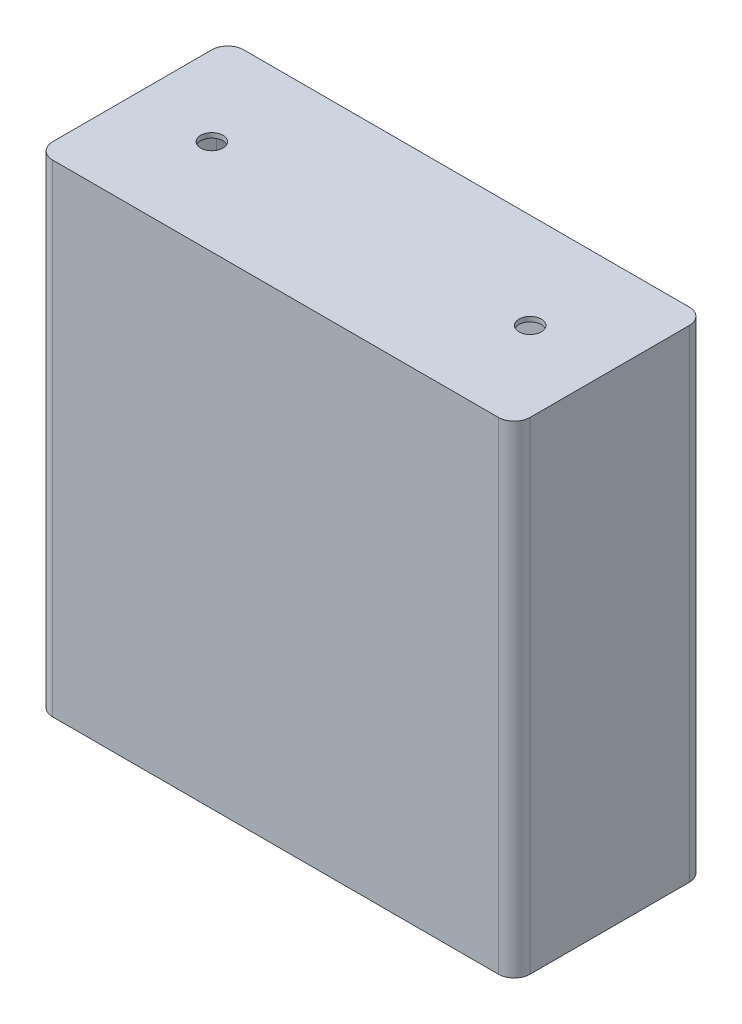
ISO-10303-21;
HEADER;
FILE_DESCRIPTION(('STEP AP214'),'2;1');
FILE_NAME('part.step','',(''),(''),'','','');
FILE_SCHEMA(('AUTOMOTIVE_DESIGN { 1 0 10303 214 1 1 1 1 }'));
ENDSEC;
DATA;
#1=APPLICATION_CONTEXT('core data for automotive mechanical design processes');
#2=APPLICATION_PROTOCOL_DEFINITION('international standard','automotive_design',2000,#1);
#3=PRODUCT_CONTEXT('',#1,'mechanical');
#4=PRODUCT('Part','Part','',(#3));
#5=PRODUCT_RELATED_PRODUCT_CATEGORY('part','',(#4));
#6=PRODUCT_DEFINITION_FORMATION('','',#4);
#7=PRODUCT_DEFINITION_CONTEXT('part definition',#1,'design');
#8=PRODUCT_DEFINITION('design','',#6,#7);
#9=PRODUCT_DEFINITION_SHAPE('','',#8);
#10=(LENGTH_UNIT() NAMED_UNIT(*) SI_UNIT(.MILLI.,.METRE.));
#11=(NAMED_UNIT(*) PLANE_ANGLE_UNIT() SI_UNIT($,.RADIAN.));
#12=(NAMED_UNIT(*) SI_UNIT($,.STERADIAN.) SOLID_ANGLE_UNIT());
#13=UNCERTAINTY_MEASURE_WITH_UNIT(LENGTH_MEASURE(1.E-05),#10,'distance_accuracy_value','');
#14=(GEOMETRIC_REPRESENTATION_CONTEXT(3) GLOBAL_UNCERTAINTY_ASSIGNED_CONTEXT((#13)) GLOBAL_UNIT_ASSIGNED_CONTEXT((#10,
#11,#12)) REPRESENTATION_CONTEXT('',''));
#15=CARTESIAN_POINT('',(0.,0.,0.));
#16=DIRECTION('',(0.,0.,1.));
#17=DIRECTION('',(1.,0.,0.));
#18=AXIS2_PLACEMENT_3D('',#15,#16,#17);
#19=CARTESIAN_POINT('',(290.,3.,-110.));
#20=DIRECTION('',(0.,-1.,0.));
#21=DIRECTION('',(0.,0.,-1.));
#22=AXIS2_PLACEMENT_3D('',#19,#20,#21);
#23=PLANE('',#22);
#24=CARTESIAN_POINT('',(50.,3.,-60.));
#25=DIRECTION('',(0.,-1.,0.));
#26=DIRECTION('',(0.,0.,-1.));
#27=AXIS2_PLACEMENT_3D('',#24,#25,#26);
#28=CIRCLE('',#27,7.);
#29=CARTESIAN_POINT('',(50.,3.,-67.));
#30=VERTEX_POINT('',#29);
#31=EDGE_CURVE('E194',#30,#30,#28,.T.);
#32=ORIENTED_EDGE('',*,*,#31,.T.);
#33=EDGE_LOOP('',(#32));
#34=FACE_BOUND('',#33,.T.);
#35=CARTESIAN_POINT('',(250.,3.,-60.));
#36=DIRECTION('',(0.,-1.,0.));
#37=DIRECTION('',(0.,0.,-1.));
#38=AXIS2_PLACEMENT_3D('',#35,#36,#37);
#39=CIRCLE('',#38,6.99999999999999);
#40=CARTESIAN_POINT('',(250.,3.,-67.));
#41=VERTEX_POINT('',#40);
#42=EDGE_CURVE('E350',#41,#41,#39,.T.);
#43=ORIENTED_EDGE('',*,*,#42,.T.);
#44=EDGE_LOOP('',(#43));
#45=FACE_BOUND('',#44,.T.);
#46=CARTESIAN_POINT('',(290.,3.,-110.));
#47=DIRECTION('',(0.,-1.,0.));
#48=DIRECTION('',(0.,0.,-1.));
#49=AXIS2_PLACEMENT_3D('',#46,#47,#48);
#50=CIRCLE('',#49,6.99999999999999);
#51=CARTESIAN_POINT('',(297.,3.,-110.));
#52=VERTEX_POINT('',#51);
#53=CARTESIAN_POINT('',(290.,3.,-117.));
#54=VERTEX_POINT('',#53);
#55=EDGE_CURVE('E216',#52,#54,#50,.F.);
#56=ORIENTED_EDGE('',*,*,#55,.T.);
#57=DIRECTION('',(-1.,0.,0.));
#58=VECTOR('',#57,1.);
#59=CARTESIAN_POINT('',(290.,3.,-117.));
#60=LINE('',#59,#58);
#61=CARTESIAN_POINT('',(10.,3.,-117.));
#62=VERTEX_POINT('',#61);
#63=EDGE_CURVE('E220',#54,#62,#60,.T.);
#64=ORIENTED_EDGE('',*,*,#63,.T.);
#65=CARTESIAN_POINT('',(10.,3.,-110.));
#66=DIRECTION('',(0.,-1.,0.));
#67=DIRECTION('',(0.,0.,-1.));
#68=AXIS2_PLACEMENT_3D('',#65,#66,#67);
#69=CIRCLE('',#68,6.99999999999999);
#70=CARTESIAN_POINT('',(3.00000000000006,3.,-110.));
#71=VERTEX_POINT('',#70);
#72=EDGE_CURVE('E234',#62,#71,#69,.F.);
#73=ORIENTED_EDGE('',*,*,#72,.T.);
#74=DIRECTION('',(0.,0.,1.));
#75=VECTOR('',#74,1.);
#76=CARTESIAN_POINT('',(3.00000000000006,3.,-110.));
#77=LINE('',#76,#75);
#78=CARTESIAN_POINT('',(3.,3.,-10.));
#79=VERTEX_POINT('',#78);
#80=EDGE_CURVE('E241',#71,#79,#77,.T.);
#81=ORIENTED_EDGE('',*,*,#80,.T.);
#82=CARTESIAN_POINT('',(10.,3.,-10.));
#83=DIRECTION('',(0.,-1.,0.));
#84=DIRECTION('',(0.,0.,-1.));
#85=AXIS2_PLACEMENT_3D('',#82,#83,#84);
#86=CIRCLE('',#85,7.);
#87=CARTESIAN_POINT('',(10.,3.,-3.));
#88=VERTEX_POINT('',#87);
#89=EDGE_CURVE('E248',#79,#88,#86,.F.);
#90=ORIENTED_EDGE('',*,*,#89,.T.);
#91=DIRECTION('',(1.,0.,0.));
#92=VECTOR('',#91,1.);
#93=CARTESIAN_POINT('',(290.,3.,-3.));
#94=LINE('',#93,#92);
#95=CARTESIAN_POINT('',(290.,3.,-3.00000000000003));
#96=VERTEX_POINT('',#95);
#97=EDGE_CURVE('E255',#88,#96,#94,.T.);
#98=ORIENTED_EDGE('',*,*,#97,.T.);
#99=CARTESIAN_POINT('',(290.,3.,-10.));
#100=DIRECTION('',(0.,-1.,0.));
#101=DIRECTION('',(0.,0.,-1.));
#102=AXIS2_PLACEMENT_3D('',#99,#100,#101);
#103=CIRCLE('',#102,6.99999999999998);
#104=CARTESIAN_POINT('',(297.,3.,-10.));
#105=VERTEX_POINT('',#104);
#106=EDGE_CURVE('E262',#96,#105,#103,.F.);
#107=ORIENTED_EDGE('',*,*,#106,.T.);
#108=DIRECTION('',(0.,0.,-1.));
#109=VECTOR('',#108,1.);
#110=CARTESIAN_POINT('',(297.,3.,-110.));
#111=LINE('',#110,#109);
#112=EDGE_CURVE('E268',#105,#52,#111,.T.);
#113=ORIENTED_EDGE('',*,*,#112,.T.);
#114=EDGE_LOOP('',(#56,#64,#73,#81,#90,#98,#107,#113));
#115=FACE_BOUND('',#114,.T.);
#116=ADVANCED_FACE('F48',(#34,#45,#115),#23,.F.);
#117=CARTESIAN_POINT('',(10.,300.,-117.));
#118=DIRECTION('',(0.,0.,1.));
#119=DIRECTION('',(1.,0.,0.));
#120=AXIS2_PLACEMENT_3D('',#117,#118,#119);
#121=PLANE('',#120);
#122=ORIENTED_EDGE('',*,*,#63,.F.);
#123=DIRECTION('',(0.,1.,0.));
#124=VECTOR('',#123,1.);
#125=CARTESIAN_POINT('',(290.,300.,-117.));
#126=LINE('',#125,#124);
#127=CARTESIAN_POINT('',(290.,300.,-117.));
#128=VERTEX_POINT('',#127);
#129=EDGE_CURVE('E221',#128,#54,#126,.F.);
#130=ORIENTED_EDGE('',*,*,#129,.F.);
#131=DIRECTION('',(-1.,0.,0.));
#132=VECTOR('',#131,1.);
#133=CARTESIAN_POINT('',(290.,300.,-117.));
#134=LINE('',#133,#132);
#135=CARTESIAN_POINT('',(10.,300.,-117.));
#136=VERTEX_POINT('',#135);
#137=EDGE_CURVE('E278',#128,#136,#134,.T.);
#138=ORIENTED_EDGE('',*,*,#137,.T.);
#139=DIRECTION('',(0.,-1.,0.));
#140=VECTOR('',#139,1.);
#141=CARTESIAN_POINT('',(10.,300.,-117.));
#142=LINE('',#141,#140);
#143=EDGE_CURVE('E225',#136,#62,#142,.T.);
#144=ORIENTED_EDGE('',*,*,#143,.T.);
#145=EDGE_LOOP('',(#122,#130,#138,#144));
#146=FACE_BOUND('',#145,.T.);
#147=ADVANCED_FACE('F401',(#146),#121,.T.);
#148=CARTESIAN_POINT('',(10.,300.,-110.));
#149=DIRECTION('',(0.,-1.,0.));
#150=DIRECTION('',(0.,0.,-1.));
#151=AXIS2_PLACEMENT_3D('',#148,#149,#150);
#152=CYLINDRICAL_SURFACE('',#151,6.99999999999999);
#153=ORIENTED_EDGE('',*,*,#72,.F.);
#154=ORIENTED_EDGE('',*,*,#143,.F.);
#155=CARTESIAN_POINT('',(10.,300.,-110.));
#156=DIRECTION('',(0.,-1.,0.));
#157=DIRECTION('',(0.,0.,-1.));
#158=AXIS2_PLACEMENT_3D('',#155,#156,#157);
#159=CIRCLE('',#158,6.99999999999999);
#160=CARTESIAN_POINT('',(3.00000000000002,300.,-110.));
#161=VERTEX_POINT('',#160);
#162=EDGE_CURVE('E282',#136,#161,#159,.F.);
#163=ORIENTED_EDGE('',*,*,#162,.T.);
#164=DIRECTION('',(0.,1.,0.));
#165=VECTOR('',#164,1.);
#166=CARTESIAN_POINT('',(3.00000000000006,300.,-110.));
#167=LINE('',#166,#165);
#168=EDGE_CURVE('E238',#161,#71,#167,.F.);
#169=ORIENTED_EDGE('',*,*,#168,.T.);
#170=EDGE_LOOP('',(#153,#154,#163,#169));
#171=FACE_BOUND('',#170,.T.);
#172=ADVANCED_FACE('F406',(#171),#152,.F.);
#173=CARTESIAN_POINT('',(3.,300.,-10.0000000000001));
#174=DIRECTION('',(1.,0.,0.));
#175=DIRECTION('',(0.,0.,-1.));
#176=AXIS2_PLACEMENT_3D('',#173,#174,#175);
#177=PLANE('',#176);
#178=ORIENTED_EDGE('',*,*,#80,.F.);
#179=ORIENTED_EDGE('',*,*,#168,.F.);
#180=DIRECTION('',(0.,0.,1.));
#181=VECTOR('',#180,1.);
#182=CARTESIAN_POINT('',(3.00000000000006,300.,-110.));
#183=LINE('',#182,#181);
#184=CARTESIAN_POINT('',(3.,300.,-10.0000000000001));
#185=VERTEX_POINT('',#184);
#186=EDGE_CURVE('E286',#161,#185,#183,.T.);
#187=ORIENTED_EDGE('',*,*,#186,.T.);
#188=DIRECTION('',(0.,-1.,0.));
#189=VECTOR('',#188,1.);
#190=CARTESIAN_POINT('',(3.,300.,-10.));
#191=LINE('',#190,#189);
#192=EDGE_CURVE('E245',#185,#79,#191,.T.);
#193=ORIENTED_EDGE('',*,*,#192,.T.);
#194=EDGE_LOOP('',(#178,#179,#187,#193));
#195=FACE_BOUND('',#194,.T.);
#196=ADVANCED_FACE('F507',(#195),#177,.T.);
#197=CARTESIAN_POINT('',(10.,300.,-10.));
#198=DIRECTION('',(0.,-1.,0.));
#199=DIRECTION('',(0.,0.,-1.));
#200=AXIS2_PLACEMENT_3D('',#197,#198,#199);
#201=CYLINDRICAL_SURFACE('',#200,7.);
#202=ORIENTED_EDGE('',*,*,#89,.F.);
#203=ORIENTED_EDGE('',*,*,#192,.F.);
#204=CARTESIAN_POINT('',(10.,300.,-10.));
#205=DIRECTION('',(0.,-1.,0.));
#206=DIRECTION('',(0.,0.,-1.));
#207=AXIS2_PLACEMENT_3D('',#204,#205,#206);
#208=CIRCLE('',#207,7.);
#209=CARTESIAN_POINT('',(10.,300.,-3.));
#210=VERTEX_POINT('',#209);
#211=EDGE_CURVE('E290',#185,#210,#208,.F.);
#212=ORIENTED_EDGE('',*,*,#211,.T.);
#213=DIRECTION('',(0.,1.,0.));
#214=VECTOR('',#213,1.);
#215=CARTESIAN_POINT('',(10.,300.,-3.));
#216=LINE('',#215,#214);
#217=EDGE_CURVE('E252',#210,#88,#216,.F.);
#218=ORIENTED_EDGE('',*,*,#217,.T.);
#219=EDGE_LOOP('',(#202,#203,#212,#218));
#220=FACE_BOUND('',#219,.T.);
#221=ADVANCED_FACE('F498',(#220),#201,.F.);
#222=CARTESIAN_POINT('',(10.0000000000001,300.,-3.));
#223=DIRECTION('',(0.,0.,-1.));
#224=DIRECTION('',(-1.,0.,0.));
#225=AXIS2_PLACEMENT_3D('',#222,#223,#224);
#226=PLANE('',#225);
#227=ORIENTED_EDGE('',*,*,#97,.F.);
#228=ORIENTED_EDGE('',*,*,#217,.F.);
#229=DIRECTION('',(1.,0.,0.));
#230=VECTOR('',#229,1.);
#231=CARTESIAN_POINT('',(290.,300.,-3.));
#232=LINE('',#231,#230);
#233=CARTESIAN_POINT('',(290.,300.,-3.));
#234=VERTEX_POINT('',#233);
#235=EDGE_CURVE('E294',#210,#234,#232,.T.);
#236=ORIENTED_EDGE('',*,*,#235,.T.);
#237=DIRECTION('',(0.,-1.,0.));
#238=VECTOR('',#237,1.);
#239=CARTESIAN_POINT('',(290.,300.,-3.00000000000003));
#240=LINE('',#239,#238);
#241=EDGE_CURVE('E259',#234,#96,#240,.T.);
#242=ORIENTED_EDGE('',*,*,#241,.T.);
#243=EDGE_LOOP('',(#227,#228,#236,#242));
#244=FACE_BOUND('',#243,.T.);
#245=ADVANCED_FACE('F490',(#244),#226,.T.);
#246=CARTESIAN_POINT('',(290.,300.,-10.));
#247=DIRECTION('',(0.,-1.,0.));
#248=DIRECTION('',(0.,0.,-1.));
#249=AXIS2_PLACEMENT_3D('',#246,#247,#248);
#250=CYLINDRICAL_SURFACE('',#249,6.99999999999998);
#251=ORIENTED_EDGE('',*,*,#106,.F.);
#252=ORIENTED_EDGE('',*,*,#241,.F.);
#253=CARTESIAN_POINT('',(290.,300.,-10.));
#254=DIRECTION('',(0.,-1.,0.));
#255=DIRECTION('',(0.,0.,-1.));
#256=AXIS2_PLACEMENT_3D('',#253,#254,#255);
#257=CIRCLE('',#256,6.99999999999998);
#258=CARTESIAN_POINT('',(297.,300.,-10.));
#259=VERTEX_POINT('',#258);
#260=EDGE_CURVE('E297',#234,#259,#257,.F.);
#261=ORIENTED_EDGE('',*,*,#260,.T.);
#262=DIRECTION('',(0.,1.,0.));
#263=VECTOR('',#262,1.);
#264=CARTESIAN_POINT('',(297.,300.,-10.));
#265=LINE('',#264,#263);
#266=EDGE_CURVE('E230',#259,#105,#265,.F.);
#267=ORIENTED_EDGE('',*,*,#266,.T.);
#268=EDGE_LOOP('',(#251,#252,#261,#267));
#269=FACE_BOUND('',#268,.T.);
#270=ADVANCED_FACE('F482',(#269),#250,.F.);
#271=CARTESIAN_POINT('',(297.,300.,-10.));
#272=DIRECTION('',(-1.,0.,0.));
#273=DIRECTION('',(0.,0.,1.));
#274=AXIS2_PLACEMENT_3D('',#271,#272,#273);
#275=PLANE('',#274);
#276=ORIENTED_EDGE('',*,*,#112,.F.);
#277=ORIENTED_EDGE('',*,*,#266,.F.);
#278=DIRECTION('',(0.,0.,-1.));
#279=VECTOR('',#278,1.);
#280=CARTESIAN_POINT('',(297.,300.,-110.));
#281=LINE('',#280,#279);
#282=CARTESIAN_POINT('',(297.,300.,-110.));
#283=VERTEX_POINT('',#282);
#284=EDGE_CURVE('E231',#259,#283,#281,.T.);
#285=ORIENTED_EDGE('',*,*,#284,.T.);
#286=DIRECTION('',(0.,-1.,0.));
#287=VECTOR('',#286,1.);
#288=CARTESIAN_POINT('',(297.,300.,-110.));
#289=LINE('',#288,#287);
#290=EDGE_CURVE('E226',#283,#52,#289,.T.);
#291=ORIENTED_EDGE('',*,*,#290,.T.);
#292=EDGE_LOOP('',(#276,#277,#285,#291));
#293=FACE_BOUND('',#292,.T.);
#294=ADVANCED_FACE('F412',(#293),#275,.T.);
#295=CARTESIAN_POINT('',(290.,300.,-110.));
#296=DIRECTION('',(0.,-1.,0.));
#297=DIRECTION('',(0.,0.,-1.));
#298=AXIS2_PLACEMENT_3D('',#295,#296,#297);
#299=CYLINDRICAL_SURFACE('',#298,6.99999999999999);
#300=ORIENTED_EDGE('',*,*,#55,.F.);
#301=ORIENTED_EDGE('',*,*,#290,.F.);
#302=CARTESIAN_POINT('',(290.,300.,-110.));
#303=DIRECTION('',(0.,-1.,0.));
#304=DIRECTION('',(0.,0.,-1.));
#305=AXIS2_PLACEMENT_3D('',#302,#303,#304);
#306=CIRCLE('',#305,6.99999999999999);
#307=EDGE_CURVE('E274',#283,#128,#306,.F.);
#308=ORIENTED_EDGE('',*,*,#307,.T.);
#309=ORIENTED_EDGE('',*,*,#129,.T.);
#310=EDGE_LOOP('',(#300,#301,#308,#309));
#311=FACE_BOUND('',#310,.T.);
#312=ADVANCED_FACE('F465',(#311),#299,.F.);
#313=CARTESIAN_POINT('',(290.,300.,-110.));
#314=DIRECTION('',(0.,1.,0.));
#315=DIRECTION('',(0.,0.,1.));
#316=AXIS2_PLACEMENT_3D('',#313,#314,#315);
#317=PLANE('',#316);
#318=CARTESIAN_POINT('',(50.,300.,-60.));
#319=DIRECTION('',(0.,1.,0.));
#320=DIRECTION('',(0.,0.,1.));
#321=AXIS2_PLACEMENT_3D('',#318,#319,#320);
#322=CIRCLE('',#321,7.);
#323=CARTESIAN_POINT('',(50.,300.,-53.));
#324=VERTEX_POINT('',#323);
#325=EDGE_CURVE('E52',#324,#324,#322,.T.);
#326=ORIENTED_EDGE('',*,*,#325,.T.);
#327=EDGE_LOOP('',(#326));
#328=FACE_BOUND('',#327,.T.);
#329=CARTESIAN_POINT('',(250.,300.,-60.));
#330=DIRECTION('',(0.,1.,0.));
#331=DIRECTION('',(0.,0.,1.));
#332=AXIS2_PLACEMENT_3D('',#329,#330,#331);
#333=CIRCLE('',#332,6.99999999999999);
#334=CARTESIAN_POINT('',(250.,300.,-53.0000000000001));
#335=VERTEX_POINT('',#334);
#336=EDGE_CURVE('E347',#335,#335,#333,.T.);
#337=ORIENTED_EDGE('',*,*,#336,.T.);
#338=EDGE_LOOP('',(#337));
#339=FACE_BOUND('',#338,.T.);
#340=ORIENTED_EDGE('',*,*,#307,.F.);
#341=ORIENTED_EDGE('',*,*,#284,.F.);
#342=ORIENTED_EDGE('',*,*,#260,.F.);
#343=ORIENTED_EDGE('',*,*,#235,.F.);
#344=ORIENTED_EDGE('',*,*,#211,.F.);
#345=ORIENTED_EDGE('',*,*,#186,.F.);
#346=ORIENTED_EDGE('',*,*,#162,.F.);
#347=ORIENTED_EDGE('',*,*,#137,.F.);
#348=EDGE_LOOP('',(#340,#341,#342,#343,#344,#345,#346,#347));
#349=FACE_BOUND('',#348,.T.);
#350=ADVANCED_FACE('F382',(#328,#339,#349),#317,.F.);
#351=CARTESIAN_POINT('',(250.,0.,-60.));
#352=DIRECTION('',(0.,1.,0.));
#353=DIRECTION('',(0.,0.,1.));
#354=AXIS2_PLACEMENT_3D('',#351,#352,#353);
#355=CYLINDRICAL_SURFACE('',#354,6.99999999999999);
#356=CARTESIAN_POINT('',(250.,303.,-60.));
#357=DIRECTION('',(0.,1.,0.));
#358=DIRECTION('',(0.,0.,1.));
#359=AXIS2_PLACEMENT_3D('',#356,#357,#358);
#360=CIRCLE('',#359,6.99999999999999);
#361=CARTESIAN_POINT('',(250.,303.,-53.0000000000001));
#362=VERTEX_POINT('',#361);
#363=EDGE_CURVE('E357',#362,#362,#360,.T.);
#364=ORIENTED_EDGE('',*,*,#363,.T.);
#365=EDGE_LOOP('',(#364));
#366=FACE_BOUND('',#365,.T.);
#367=ORIENTED_EDGE('',*,*,#336,.F.);
#368=EDGE_LOOP('',(#367));
#369=FACE_BOUND('',#368,.T.);
#370=ADVANCED_FACE('F387',(#366,#369),#355,.F.);
#371=CARTESIAN_POINT('',(50.,0.,-60.));
#372=DIRECTION('',(0.,1.,0.));
#373=DIRECTION('',(0.,0.,1.));
#374=AXIS2_PLACEMENT_3D('',#371,#372,#373);
#375=CYLINDRICAL_SURFACE('',#374,7.);
#376=CARTESIAN_POINT('',(50.,303.,-60.));
#377=DIRECTION('',(0.,1.,0.));
#378=DIRECTION('',(0.,0.,1.));
#379=AXIS2_PLACEMENT_3D('',#376,#377,#378);
#380=CIRCLE('',#379,7.);
#381=CARTESIAN_POINT('',(50.,303.,-53.));
#382=VERTEX_POINT('',#381);
#383=EDGE_CURVE('E187',#382,#382,#380,.T.);
#384=ORIENTED_EDGE('',*,*,#383,.T.);
#385=EDGE_LOOP('',(#384));
#386=FACE_BOUND('',#385,.T.);
#387=ORIENTED_EDGE('',*,*,#325,.F.);
#388=EDGE_LOOP('',(#387));
#389=FACE_BOUND('',#388,.T.);
#390=ADVANCED_FACE('F384',(#386,#389),#375,.F.);
#391=CARTESIAN_POINT('',(250.,0.,-60.));
#392=DIRECTION('',(0.,1.,0.));
#393=DIRECTION('',(0.,0.,-1.));
#394=AXIS2_PLACEMENT_3D('',#391,#392,#393);
#395=CIRCLE('',#394,6.99999999999999);
#396=CARTESIAN_POINT('',(250.,0.,-67.));
#397=VERTEX_POINT('',#396);
#398=EDGE_CURVE('E361',#397,#397,#395,.T.);
#399=ORIENTED_EDGE('',*,*,#398,.F.);
#400=EDGE_LOOP('',(#399));
#401=FACE_BOUND('',#400,.T.);
#402=ORIENTED_EDGE('',*,*,#42,.F.);
#403=EDGE_LOOP('',(#402));
#404=FACE_BOUND('',#403,.T.);
#405=ADVANCED_FACE('F386',(#401,#404),#355,.F.);
#406=CARTESIAN_POINT('',(50.,0.,-60.));
#407=DIRECTION('',(0.,1.,0.));
#408=DIRECTION('',(0.,0.,1.));
#409=AXIS2_PLACEMENT_3D('',#406,#407,#408);
#410=CIRCLE('',#409,7.);
#411=CARTESIAN_POINT('',(50.,0.,-53.));
#412=VERTEX_POINT('',#411);
#413=EDGE_CURVE('E351',#412,#412,#410,.T.);
#414=ORIENTED_EDGE('',*,*,#413,.F.);
#415=EDGE_LOOP('',(#414));
#416=FACE_BOUND('',#415,.T.);
#417=ORIENTED_EDGE('',*,*,#31,.F.);
#418=EDGE_LOOP('',(#417));
#419=FACE_BOUND('',#418,.T.);
#420=ADVANCED_FACE('F390',(#416,#419),#375,.F.);
#421=CARTESIAN_POINT('',(290.,300.,-110.));
#422=DIRECTION('',(0.,-1.,0.));
#423=DIRECTION('',(0.,0.,-1.));
#424=AXIS2_PLACEMENT_3D('',#421,#422,#423);
#425=CYLINDRICAL_SURFACE('',#424,9.99999999999999);
#426=CARTESIAN_POINT('',(290.,0.,-110.));
#427=DIRECTION('',(0.,1.,0.));
#428=DIRECTION('',(0.,0.,-1.));
#429=AXIS2_PLACEMENT_3D('',#426,#427,#428);
#430=CIRCLE('',#429,9.99999999999999);
#431=CARTESIAN_POINT('',(300.,0.,-110.));
#432=VERTEX_POINT('',#431);
#433=CARTESIAN_POINT('',(290.,0.,-120.));
#434=VERTEX_POINT('',#433);
#435=EDGE_CURVE('E169',#432,#434,#430,.T.);
#436=ORIENTED_EDGE('',*,*,#435,.T.);
#437=DIRECTION('',(0.,-1.,0.));
#438=VECTOR('',#437,1.);
#439=CARTESIAN_POINT('',(290.,300.,-120.));
#440=LINE('',#439,#438);
#441=CARTESIAN_POINT('',(290.,303.,-120.));
#442=VERTEX_POINT('',#441);
#443=EDGE_CURVE('E11',#442,#434,#440,.T.);
#444=ORIENTED_EDGE('',*,*,#443,.F.);
#445=CARTESIAN_POINT('',(290.,303.,-110.));
#446=DIRECTION('',(0.,1.,0.));
#447=DIRECTION('',(0.,0.,1.));
#448=AXIS2_PLACEMENT_3D('',#445,#446,#447);
#449=CIRCLE('',#448,10.);
#450=CARTESIAN_POINT('',(300.,303.,-110.));
#451=VERTEX_POINT('',#450);
#452=EDGE_CURVE('E167',#451,#442,#449,.T.);
#453=ORIENTED_EDGE('',*,*,#452,.F.);
#454=DIRECTION('',(0.,-1.,0.));
#455=VECTOR('',#454,1.);
#456=CARTESIAN_POINT('',(300.,300.,-110.));
#457=LINE('',#456,#455);
#458=EDGE_CURVE('E325',#451,#432,#457,.T.);
#459=ORIENTED_EDGE('',*,*,#458,.T.);
#460=EDGE_LOOP('',(#436,#444,#453,#459));
#461=FACE_BOUND('',#460,.T.);
#462=ADVANCED_FACE('F50',(#461),#425,.T.);
#463=CARTESIAN_POINT('',(10.,300.,-120.));
#464=DIRECTION('',(0.,0.,1.));
#465=DIRECTION('',(1.,0.,0.));
#466=AXIS2_PLACEMENT_3D('',#463,#464,#465);
#467=PLANE('',#466);
#468=DIRECTION('',(-1.,0.,0.));
#469=VECTOR('',#468,1.);
#470=CARTESIAN_POINT('',(10.,0.,-120.));
#471=LINE('',#470,#469);
#472=CARTESIAN_POINT('',(10.,0.,-120.));
#473=VERTEX_POINT('',#472);
#474=EDGE_CURVE('E306',#434,#473,#471,.T.);
#475=ORIENTED_EDGE('',*,*,#474,.T.);
#476=DIRECTION('',(0.,-1.,0.));
#477=VECTOR('',#476,1.);
#478=CARTESIAN_POINT('',(10.,300.,-120.));
#479=LINE('',#478,#477);
#480=CARTESIAN_POINT('',(10.,303.,-120.));
#481=VERTEX_POINT('',#480);
#482=EDGE_CURVE('E58',#481,#473,#479,.T.);
#483=ORIENTED_EDGE('',*,*,#482,.F.);
#484=DIRECTION('',(-1.,0.,0.));
#485=VECTOR('',#484,1.);
#486=CARTESIAN_POINT('',(10.,303.,-120.));
#487=LINE('',#486,#485);
#488=EDGE_CURVE('E172',#442,#481,#487,.T.);
#489=ORIENTED_EDGE('',*,*,#488,.F.);
#490=ORIENTED_EDGE('',*,*,#443,.T.);
#491=EDGE_LOOP('',(#475,#483,#489,#490));
#492=FACE_BOUND('',#491,.T.);
#493=ADVANCED_FACE('F173',(#492),#467,.F.);
#494=CARTESIAN_POINT('',(10.,300.,-110.));
#495=DIRECTION('',(0.,-1.,0.));
#496=DIRECTION('',(0.,0.,-1.));
#497=AXIS2_PLACEMENT_3D('',#494,#495,#496);
#498=CYLINDRICAL_SURFACE('',#497,9.99999999999999);
#499=CARTESIAN_POINT('',(10.,0.,-110.));
#500=DIRECTION('',(0.,1.,0.));
#501=DIRECTION('',(0.,0.,-1.));
#502=AXIS2_PLACEMENT_3D('',#499,#500,#501);
#503=CIRCLE('',#502,9.99999999999999);
#504=CARTESIAN_POINT('',(0.,0.,-110.));
#505=VERTEX_POINT('',#504);
#506=EDGE_CURVE('E309',#473,#505,#503,.T.);
#507=ORIENTED_EDGE('',*,*,#506,.T.);
#508=DIRECTION('',(0.,-1.,0.));
#509=VECTOR('',#508,1.);
#510=CARTESIAN_POINT('',(0.,300.,-110.));
#511=LINE('',#510,#509);
#512=CARTESIAN_POINT('',(0.,303.,-110.));
#513=VERTEX_POINT('',#512);
#514=EDGE_CURVE('E342',#513,#505,#511,.T.);
#515=ORIENTED_EDGE('',*,*,#514,.F.);
#516=CARTESIAN_POINT('',(10.,303.,-110.));
#517=DIRECTION('',(0.,1.,0.));
#518=DIRECTION('',(0.,0.,-1.));
#519=AXIS2_PLACEMENT_3D('',#516,#517,#518);
#520=CIRCLE('',#519,10.);
#521=EDGE_CURVE('E179',#481,#513,#520,.T.);
#522=ORIENTED_EDGE('',*,*,#521,.F.);
#523=ORIENTED_EDGE('',*,*,#482,.T.);
#524=EDGE_LOOP('',(#507,#515,#522,#523));
#525=FACE_BOUND('',#524,.T.);
#526=ADVANCED_FACE('F434',(#525),#498,.T.);
#527=CARTESIAN_POINT('',(0.,300.,-10.0000000000001));
#528=DIRECTION('',(1.,0.,0.));
#529=DIRECTION('',(0.,0.,-1.));
#530=AXIS2_PLACEMENT_3D('',#527,#528,#529);
#531=PLANE('',#530);
#532=DIRECTION('',(0.,0.,1.));
#533=VECTOR('',#532,1.);
#534=CARTESIAN_POINT('',(0.,0.,-10.0000000000001));
#535=LINE('',#534,#533);
#536=CARTESIAN_POINT('',(0.,0.,-10.0000000000001));
#537=VERTEX_POINT('',#536);
#538=EDGE_CURVE('E312',#505,#537,#535,.T.);
#539=ORIENTED_EDGE('',*,*,#538,.T.);
#540=DIRECTION('',(0.,-1.,0.));
#541=VECTOR('',#540,1.);
#542=CARTESIAN_POINT('',(0.,300.,-10.0000000000001));
#543=LINE('',#542,#541);
#544=CARTESIAN_POINT('',(0.,303.,-10.0000000000001));
#545=VERTEX_POINT('',#544);
#546=EDGE_CURVE('E338',#545,#537,#543,.T.);
#547=ORIENTED_EDGE('',*,*,#546,.F.);
#548=DIRECTION('',(0.,0.,1.));
#549=VECTOR('',#548,1.);
#550=CARTESIAN_POINT('',(0.,303.,-10.0000000000001));
#551=LINE('',#550,#549);
#552=EDGE_CURVE('E200',#513,#545,#551,.T.);
#553=ORIENTED_EDGE('',*,*,#552,.F.);
#554=ORIENTED_EDGE('',*,*,#514,.T.);
#555=EDGE_LOOP('',(#539,#547,#553,#554));
#556=FACE_BOUND('',#555,.T.);
#557=ADVANCED_FACE('F430',(#556),#531,.F.);
#558=CARTESIAN_POINT('',(10.,300.,-10.));
#559=DIRECTION('',(0.,-1.,0.));
#560=DIRECTION('',(0.,0.,-1.));
#561=AXIS2_PLACEMENT_3D('',#558,#559,#560);
#562=CYLINDRICAL_SURFACE('',#561,10.);
#563=CARTESIAN_POINT('',(10.,0.,-10.));
#564=DIRECTION('',(0.,1.,0.));
#565=DIRECTION('',(0.,0.,1.));
#566=AXIS2_PLACEMENT_3D('',#563,#564,#565);
#567=CIRCLE('',#566,10.);
#568=CARTESIAN_POINT('',(10.,0.,0.));
#569=VERTEX_POINT('',#568);
#570=EDGE_CURVE('E315',#537,#569,#567,.T.);
#571=ORIENTED_EDGE('',*,*,#570,.T.);
#572=DIRECTION('',(0.,-1.,0.));
#573=VECTOR('',#572,1.);
#574=CARTESIAN_POINT('',(10.,300.,0.));
#575=LINE('',#574,#573);
#576=CARTESIAN_POINT('',(10.0000000000001,303.,0.));
#577=VERTEX_POINT('',#576);
#578=EDGE_CURVE('E334',#577,#569,#575,.T.);
#579=ORIENTED_EDGE('',*,*,#578,.F.);
#580=CARTESIAN_POINT('',(10.,303.,-10.));
#581=DIRECTION('',(0.,1.,0.));
#582=DIRECTION('',(0.,0.,1.));
#583=AXIS2_PLACEMENT_3D('',#580,#581,#582);
#584=CIRCLE('',#583,10.);
#585=EDGE_CURVE('E203',#545,#577,#584,.T.);
#586=ORIENTED_EDGE('',*,*,#585,.F.);
#587=ORIENTED_EDGE('',*,*,#546,.T.);
#588=EDGE_LOOP('',(#571,#579,#586,#587));
#589=FACE_BOUND('',#588,.T.);
#590=ADVANCED_FACE('F426',(#589),#562,.T.);
#591=CARTESIAN_POINT('',(10.0000000000001,300.,0.));
#592=DIRECTION('',(0.,0.,-1.));
#593=DIRECTION('',(-1.,0.,0.));
#594=AXIS2_PLACEMENT_3D('',#591,#592,#593);
#595=PLANE('',#594);
#596=DIRECTION('',(1.,0.,0.));
#597=VECTOR('',#596,1.);
#598=CARTESIAN_POINT('',(10.0000000000001,0.,0.));
#599=LINE('',#598,#597);
#600=CARTESIAN_POINT('',(290.,0.,0.));
#601=VERTEX_POINT('',#600);
#602=EDGE_CURVE('E318',#569,#601,#599,.T.);
#603=ORIENTED_EDGE('',*,*,#602,.T.);
#604=DIRECTION('',(0.,-1.,0.));
#605=VECTOR('',#604,1.);
#606=CARTESIAN_POINT('',(290.,300.,0.));
#607=LINE('',#606,#605);
#608=CARTESIAN_POINT('',(290.,303.,0.));
#609=VERTEX_POINT('',#608);
#610=EDGE_CURVE('E331',#609,#601,#607,.T.);
#611=ORIENTED_EDGE('',*,*,#610,.F.);
#612=DIRECTION('',(1.,0.,0.));
#613=VECTOR('',#612,1.);
#614=CARTESIAN_POINT('',(10.0000000000001,303.,0.));
#615=LINE('',#614,#613);
#616=EDGE_CURVE('E207',#577,#609,#615,.T.);
#617=ORIENTED_EDGE('',*,*,#616,.F.);
#618=ORIENTED_EDGE('',*,*,#578,.T.);
#619=EDGE_LOOP('',(#603,#611,#617,#618));
#620=FACE_BOUND('',#619,.T.);
#621=ADVANCED_FACE('F423',(#620),#595,.F.);
#622=CARTESIAN_POINT('',(290.,300.,-10.));
#623=DIRECTION('',(0.,-1.,0.));
#624=DIRECTION('',(0.,0.,-1.));
#625=AXIS2_PLACEMENT_3D('',#622,#623,#624);
#626=CYLINDRICAL_SURFACE('',#625,9.99999999999998);
#627=CARTESIAN_POINT('',(290.,0.,-10.));
#628=DIRECTION('',(0.,1.,0.));
#629=DIRECTION('',(0.,0.,-1.));
#630=AXIS2_PLACEMENT_3D('',#627,#628,#629);
#631=CIRCLE('',#630,9.99999999999998);
#632=CARTESIAN_POINT('',(300.,0.,-10.));
#633=VERTEX_POINT('',#632);
#634=EDGE_CURVE('E74',#601,#633,#631,.T.);
#635=ORIENTED_EDGE('',*,*,#634,.T.);
#636=DIRECTION('',(0.,-1.,0.));
#637=VECTOR('',#636,1.);
#638=CARTESIAN_POINT('',(300.,300.,-10.));
#639=LINE('',#638,#637);
#640=CARTESIAN_POINT('',(300.,303.,-10.));
#641=VERTEX_POINT('',#640);
#642=EDGE_CURVE('E328',#641,#633,#639,.T.);
#643=ORIENTED_EDGE('',*,*,#642,.F.);
#644=CARTESIAN_POINT('',(290.,303.,-10.));
#645=DIRECTION('',(0.,1.,0.));
#646=DIRECTION('',(0.,0.,-1.));
#647=AXIS2_PLACEMENT_3D('',#644,#645,#646);
#648=CIRCLE('',#647,10.);
#649=EDGE_CURVE('E211',#609,#641,#648,.T.);
#650=ORIENTED_EDGE('',*,*,#649,.F.);
#651=ORIENTED_EDGE('',*,*,#610,.T.);
#652=EDGE_LOOP('',(#635,#643,#650,#651));
#653=FACE_BOUND('',#652,.T.);
#654=ADVANCED_FACE('F420',(#653),#626,.T.);
#655=CARTESIAN_POINT('',(300.,300.,-10.));
#656=DIRECTION('',(-1.,0.,0.));
#657=DIRECTION('',(0.,0.,1.));
#658=AXIS2_PLACEMENT_3D('',#655,#656,#657);
#659=PLANE('',#658);
#660=DIRECTION('',(0.,0.,-1.));
#661=VECTOR('',#660,1.);
#662=CARTESIAN_POINT('',(300.,0.,-10.));
#663=LINE('',#662,#661);
#664=EDGE_CURVE('E66',#633,#432,#663,.T.);
#665=ORIENTED_EDGE('',*,*,#664,.T.);
#666=ORIENTED_EDGE('',*,*,#458,.F.);
#667=DIRECTION('',(0.,0.,-1.));
#668=VECTOR('',#667,1.);
#669=CARTESIAN_POINT('',(300.,303.,-10.));
#670=LINE('',#669,#668);
#671=EDGE_CURVE('E185',#641,#451,#670,.T.);
#672=ORIENTED_EDGE('',*,*,#671,.F.);
#673=ORIENTED_EDGE('',*,*,#642,.T.);
#674=EDGE_LOOP('',(#665,#666,#672,#673));
#675=FACE_BOUND('',#674,.T.);
#676=ADVANCED_FACE('F417',(#675),#659,.F.);
#677=CARTESIAN_POINT('',(290.,0.,-110.));
#678=DIRECTION('',(0.,-1.,0.));
#679=DIRECTION('',(0.,0.,-1.));
#680=AXIS2_PLACEMENT_3D('',#677,#678,#679);
#681=PLANE('',#680);
#682=ORIENTED_EDGE('',*,*,#413,.T.);
#683=EDGE_LOOP('',(#682));
#684=FACE_BOUND('',#683,.T.);
#685=ORIENTED_EDGE('',*,*,#398,.T.);
#686=EDGE_LOOP('',(#685));
#687=FACE_BOUND('',#686,.T.);
#688=ORIENTED_EDGE('',*,*,#435,.F.);
#689=ORIENTED_EDGE('',*,*,#664,.F.);
#690=ORIENTED_EDGE('',*,*,#634,.F.);
#691=ORIENTED_EDGE('',*,*,#602,.F.);
#692=ORIENTED_EDGE('',*,*,#570,.F.);
#693=ORIENTED_EDGE('',*,*,#538,.F.);
#694=ORIENTED_EDGE('',*,*,#506,.F.);
#695=ORIENTED_EDGE('',*,*,#474,.F.);
#696=EDGE_LOOP('',(#688,#689,#690,#691,#692,#693,#694,#695));
#697=FACE_BOUND('',#696,.T.);
#698=ADVANCED_FACE('F414',(#684,#687,#697),#681,.T.);
#699=CARTESIAN_POINT('',(290.,303.,-110.));
#700=DIRECTION('',(0.,1.,0.));
#701=DIRECTION('',(0.,0.,1.));
#702=AXIS2_PLACEMENT_3D('',#699,#700,#701);
#703=PLANE('',#702);
#704=ORIENTED_EDGE('',*,*,#383,.F.);
#705=EDGE_LOOP('',(#704));
#706=FACE_BOUND('',#705,.T.);
#707=ORIENTED_EDGE('',*,*,#363,.F.);
#708=EDGE_LOOP('',(#707));
#709=FACE_BOUND('',#708,.T.);
#710=ORIENTED_EDGE('',*,*,#452,.T.);
#711=ORIENTED_EDGE('',*,*,#488,.T.);
#712=ORIENTED_EDGE('',*,*,#521,.T.);
#713=ORIENTED_EDGE('',*,*,#552,.T.);
#714=ORIENTED_EDGE('',*,*,#585,.T.);
#715=ORIENTED_EDGE('',*,*,#616,.T.);
#716=ORIENTED_EDGE('',*,*,#649,.T.);
#717=ORIENTED_EDGE('',*,*,#671,.T.);
#718=EDGE_LOOP('',(#710,#711,#712,#713,#714,#715,#716,#717));
#719=FACE_BOUND('',#718,.T.);
#720=ADVANCED_FACE('F182',(#706,#709,#719),#703,.T.);
#721=CLOSED_SHELL('',(#116,#147,#172,#196,#221,#245,#270,#294,#312,#350,#370,#390,#405,#420,
#462,#493,#526,#557,#590,#621,#654,#676,#698,#720));
#722=MANIFOLD_SOLID_BREP('B2',#721);
#723=ADVANCED_BREP_SHAPE_REPRESENTATION('',(#18,#722),#14);
#724=SHAPE_DEFINITION_REPRESENTATION(#9,#723);
ENDSEC;
END-ISO-10303-21;
